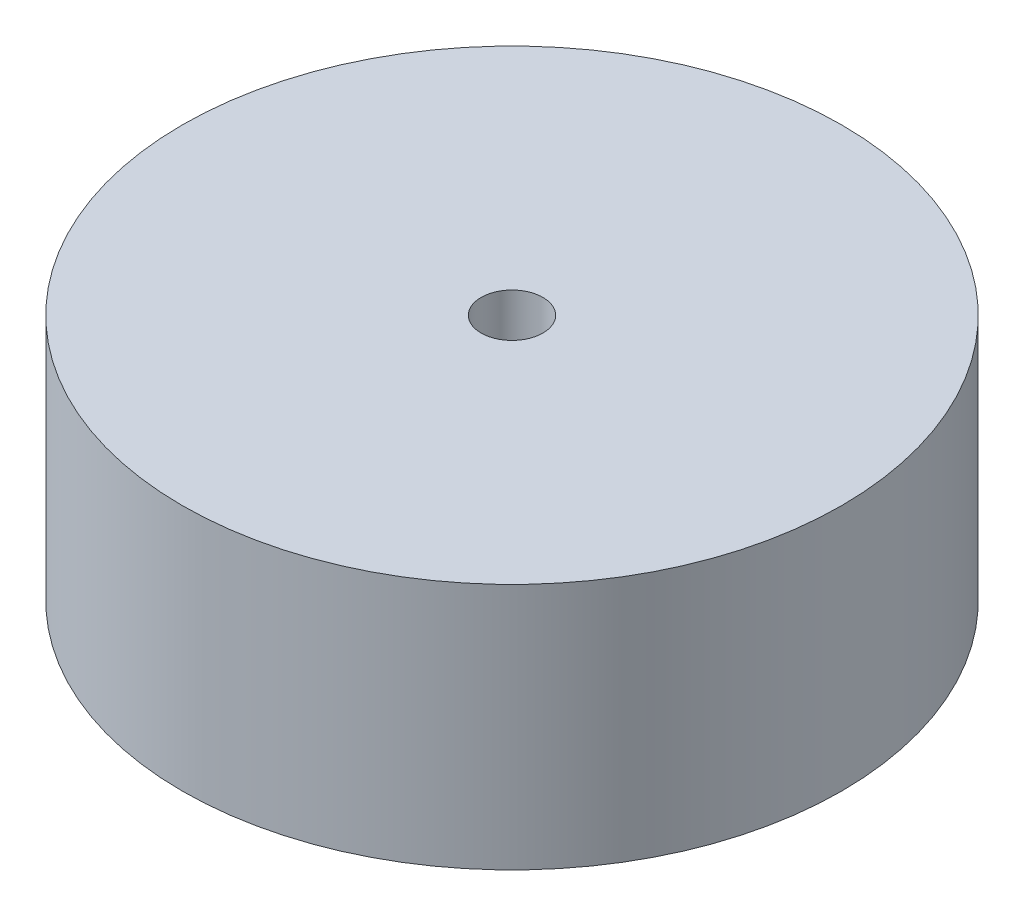
ISO-10303-21;
HEADER;
FILE_DESCRIPTION(('STEP AP214'),'2;1');
FILE_NAME('part.step','',(''),(''),'','','');
FILE_SCHEMA(('AUTOMOTIVE_DESIGN { 1 0 10303 214 1 1 1 1 }'));
ENDSEC;
DATA;
#1=APPLICATION_CONTEXT('core data for automotive mechanical design processes');
#2=APPLICATION_PROTOCOL_DEFINITION('international standard','automotive_design',2000,#1);
#3=PRODUCT_CONTEXT('',#1,'mechanical');
#4=PRODUCT('Part','Part','',(#3));
#5=PRODUCT_RELATED_PRODUCT_CATEGORY('part','',(#4));
#6=PRODUCT_DEFINITION_FORMATION('','',#4);
#7=PRODUCT_DEFINITION_CONTEXT('part definition',#1,'design');
#8=PRODUCT_DEFINITION('design','',#6,#7);
#9=PRODUCT_DEFINITION_SHAPE('','',#8);
#10=(LENGTH_UNIT() NAMED_UNIT(*) SI_UNIT(.MILLI.,.METRE.));
#11=(NAMED_UNIT(*) PLANE_ANGLE_UNIT() SI_UNIT($,.RADIAN.));
#12=(NAMED_UNIT(*) SI_UNIT($,.STERADIAN.) SOLID_ANGLE_UNIT());
#13=UNCERTAINTY_MEASURE_WITH_UNIT(LENGTH_MEASURE(1.E-05),#10,'distance_accuracy_value','');
#14=(GEOMETRIC_REPRESENTATION_CONTEXT(3) GLOBAL_UNCERTAINTY_ASSIGNED_CONTEXT((#13)) GLOBAL_UNIT_ASSIGNED_CONTEXT((#10,
#11,#12)) REPRESENTATION_CONTEXT('',''));
#15=CARTESIAN_POINT('',(0.,0.,0.));
#16=DIRECTION('',(0.,0.,1.));
#17=DIRECTION('',(1.,0.,0.));
#18=AXIS2_PLACEMENT_3D('',#15,#16,#17);
#19=CARTESIAN_POINT('',(0.,76.2,0.));
#20=DIRECTION('',(0.,-1.,0.));
#21=DIRECTION('',(0.,0.,-1.));
#22=AXIS2_PLACEMENT_3D('',#19,#20,#21);
#23=CYLINDRICAL_SURFACE('',#22,101.6);
#24=CARTESIAN_POINT('',(0.,76.2,0.));
#25=DIRECTION('',(0.,1.,0.));
#26=DIRECTION('',(0.,0.,1.));
#27=AXIS2_PLACEMENT_3D('',#24,#25,#26);
#28=CIRCLE('',#27,101.6);
#29=CARTESIAN_POINT('',(0.,76.2,-101.6));
#30=VERTEX_POINT('',#29);
#31=EDGE_CURVE('E10',#30,#30,#28,.T.);
#32=CARTESIAN_POINT('',(0.,0.,0.));
#33=DIRECTION('',(0.,1.,0.));
#34=DIRECTION('',(0.,0.,1.));
#35=AXIS2_PLACEMENT_3D('',#32,#33,#34);
#36=CIRCLE('',#35,101.6);
#37=CARTESIAN_POINT('',(0.,0.,-101.6));
#38=VERTEX_POINT('',#37);
#39=EDGE_CURVE('E40',#38,#38,#36,.T.);
#40=CARTESIAN_POINT('',(0.,76.2,-101.6));
#41=CARTESIAN_POINT('',(0.,75.40625,-101.6));
#42=CARTESIAN_POINT('',(0.,74.6125,-101.6));
#43=CARTESIAN_POINT('',(0.,73.025,-101.6));
#44=CARTESIAN_POINT('',(0.,72.23125,-101.6));
#45=CARTESIAN_POINT('',(0.,70.64375,-101.6));
#46=CARTESIAN_POINT('',(0.,69.85,-101.6));
#47=CARTESIAN_POINT('',(0.,68.2625,-101.6));
#48=CARTESIAN_POINT('',(0.,67.46875,-101.6));
#49=CARTESIAN_POINT('',(0.,65.88125,-101.6));
#50=CARTESIAN_POINT('',(0.,65.0875,-101.6));
#51=CARTESIAN_POINT('',(0.,63.5,-101.6));
#52=CARTESIAN_POINT('',(0.,62.70625,-101.6));
#53=CARTESIAN_POINT('',(0.,61.11875,-101.6));
#54=CARTESIAN_POINT('',(0.,60.325,-101.6));
#55=CARTESIAN_POINT('',(0.,58.7375,-101.6));
#56=CARTESIAN_POINT('',(0.,57.94375,-101.6));
#57=CARTESIAN_POINT('',(0.,56.35625,-101.6));
#58=CARTESIAN_POINT('',(0.,55.5625,-101.6));
#59=CARTESIAN_POINT('',(0.,53.975,-101.6));
#60=CARTESIAN_POINT('',(0.,53.18125,-101.6));
#61=CARTESIAN_POINT('',(0.,51.59375,-101.6));
#62=CARTESIAN_POINT('',(0.,50.8,-101.6));
#63=CARTESIAN_POINT('',(0.,49.2125,-101.6));
#64=CARTESIAN_POINT('',(0.,48.41875,-101.6));
#65=CARTESIAN_POINT('',(0.,46.83125,-101.6));
#66=CARTESIAN_POINT('',(0.,46.0375,-101.6));
#67=CARTESIAN_POINT('',(0.,44.45,-101.6));
#68=CARTESIAN_POINT('',(0.,43.65625,-101.6));
#69=CARTESIAN_POINT('',(0.,42.06875,-101.6));
#70=CARTESIAN_POINT('',(0.,41.275,-101.6));
#71=CARTESIAN_POINT('',(0.,39.6875,-101.6));
#72=CARTESIAN_POINT('',(0.,38.89375,-101.6));
#73=CARTESIAN_POINT('',(0.,37.30625,-101.6));
#74=CARTESIAN_POINT('',(0.,36.5125,-101.6));
#75=CARTESIAN_POINT('',(0.,34.925,-101.6));
#76=CARTESIAN_POINT('',(0.,34.13125,-101.6));
#77=CARTESIAN_POINT('',(0.,32.54375,-101.6));
#78=CARTESIAN_POINT('',(0.,31.75,-101.6));
#79=CARTESIAN_POINT('',(0.,30.1625,-101.6));
#80=CARTESIAN_POINT('',(0.,29.36875,-101.6));
#81=CARTESIAN_POINT('',(0.,27.78125,-101.6));
#82=CARTESIAN_POINT('',(0.,26.9875,-101.6));
#83=CARTESIAN_POINT('',(0.,25.4,-101.6));
#84=CARTESIAN_POINT('',(0.,24.60625,-101.6));
#85=CARTESIAN_POINT('',(0.,23.01875,-101.6));
#86=CARTESIAN_POINT('',(0.,22.225,-101.6));
#87=CARTESIAN_POINT('',(0.,20.6375,-101.6));
#88=CARTESIAN_POINT('',(0.,19.84375,-101.6));
#89=CARTESIAN_POINT('',(0.,18.25625,-101.6));
#90=CARTESIAN_POINT('',(0.,17.4625,-101.6));
#91=CARTESIAN_POINT('',(0.,15.875,-101.6));
#92=CARTESIAN_POINT('',(0.,15.08125,-101.6));
#93=CARTESIAN_POINT('',(0.,13.49375,-101.6));
#94=CARTESIAN_POINT('',(0.,12.7,-101.6));
#95=CARTESIAN_POINT('',(0.,11.1125,-101.6));
#96=CARTESIAN_POINT('',(0.,10.31875,-101.6));
#97=CARTESIAN_POINT('',(0.,8.73125,-101.6));
#98=CARTESIAN_POINT('',(0.,7.93750000000001,-101.6));
#99=CARTESIAN_POINT('',(0.,6.35,-101.6));
#100=CARTESIAN_POINT('',(0.,5.55625,-101.6));
#101=CARTESIAN_POINT('',(0.,3.96875,-101.6));
#102=CARTESIAN_POINT('',(0.,3.175,-101.6));
#103=CARTESIAN_POINT('',(0.,1.5875,-101.6));
#104=CARTESIAN_POINT('',(0.,0.793750000000001,-101.6));
#105=CARTESIAN_POINT('',(0.,0.,-101.6));
#106=B_SPLINE_CURVE_WITH_KNOTS('',3,(#40,#41,#42,#43,#44,#45,#46,#47,#48,#49,#50,#51,#52,#53,
#54,#55,#56,#57,#58,#59,#60,#61,#62,#63,#64,#65,#66,#67,#68,#69,#70,#71,#72,#73,#74,#75,#76,#77,
#78,#79,#80,#81,#82,#83,#84,#85,#86,#87,#88,#89,#90,#91,#92,#93,#94,#95,#96,#97,#98,#99,#100,
#101,#102,#103,#104,#105),.UNSPECIFIED.,.F.,.F.,(4,2,2,2,2,2,2,2,2,2,2,2,2,2,2,2,2,2,2,2,2,2,2,
2,2,2,2,2,2,2,2,2,4),(0.,2.38125,4.7625,7.14375,9.52500000000001,11.90625,14.2875,16.66875,
19.05,21.43125,23.8125,26.19375,28.575,30.95625,33.3375,35.71875,38.1,40.48125,42.8625,45.24375,
47.625,50.00625,52.3875,54.76875,57.15,59.53125,61.9125,64.29375,66.675,69.05625,71.4375,
73.81875,76.2),.UNSPECIFIED.);
#107=EDGE_CURVE('BSEAM37',#30,#38,#106,.T.);
#108=ORIENTED_EDGE('',*,*,#31,.F.);
#109=ORIENTED_EDGE('',*,*,#39,.T.);
#110=ORIENTED_EDGE('',*,*,#107,.T.);
#111=ORIENTED_EDGE('',*,*,#107,.F.);
#112=EDGE_LOOP('',(#108,#110,#109,#111));
#113=FACE_BOUND('',#112,.T.);
#114=ADVANCED_FACE('F37',(#113),#23,.T.);
#115=CARTESIAN_POINT('',(0.,76.2,0.));
#116=DIRECTION('',(0.,1.,0.));
#117=DIRECTION('',(0.,0.,1.));
#118=AXIS2_PLACEMENT_3D('',#115,#116,#117);
#119=PLANE('',#118);
#120=CARTESIAN_POINT('',(0.,76.2,0.));
#121=DIRECTION('',(0.,1.,0.));
#122=DIRECTION('',(0.,0.,1.));
#123=AXIS2_PLACEMENT_3D('',#120,#121,#122);
#124=CIRCLE('',#123,9.525);
#125=CARTESIAN_POINT('',(0.,76.2,9.525));
#126=VERTEX_POINT('',#125);
#127=EDGE_CURVE('E51',#126,#126,#124,.T.);
#128=ORIENTED_EDGE('',*,*,#127,.F.);
#129=EDGE_LOOP('',(#128));
#130=FACE_BOUND('',#129,.T.);
#131=ORIENTED_EDGE('',*,*,#31,.T.);
#132=EDGE_LOOP('',(#131));
#133=FACE_BOUND('',#132,.T.);
#134=ADVANCED_FACE('F68',(#130,#133),#119,.T.);
#135=CARTESIAN_POINT('',(0.,0.,0.));
#136=DIRECTION('',(0.,1.,0.));
#137=DIRECTION('',(0.,0.,1.));
#138=AXIS2_PLACEMENT_3D('',#135,#136,#137);
#139=PLANE('',#138);
#140=CARTESIAN_POINT('',(0.,0.,0.));
#141=DIRECTION('',(0.,1.,0.));
#142=DIRECTION('',(0.,0.,1.));
#143=AXIS2_PLACEMENT_3D('',#140,#141,#142);
#144=CIRCLE('',#143,9.525);
#145=CARTESIAN_POINT('',(0.,0.,9.525));
#146=VERTEX_POINT('',#145);
#147=EDGE_CURVE('E49',#146,#146,#144,.T.);
#148=ORIENTED_EDGE('',*,*,#147,.T.);
#149=EDGE_LOOP('',(#148));
#150=FACE_BOUND('',#149,.T.);
#151=ORIENTED_EDGE('',*,*,#39,.F.);
#152=EDGE_LOOP('',(#151));
#153=FACE_BOUND('',#152,.T.);
#154=ADVANCED_FACE('F59',(#150,#153),#139,.F.);
#155=CARTESIAN_POINT('',(0.,0.,0.));
#156=DIRECTION('',(0.,1.,0.));
#157=DIRECTION('',(0.,0.,1.));
#158=AXIS2_PLACEMENT_3D('',#155,#156,#157);
#159=CYLINDRICAL_SURFACE('',#158,9.525);
#160=CARTESIAN_POINT('',(0.,0.,9.525));
#161=CARTESIAN_POINT('',(0.,0.79375,9.525));
#162=CARTESIAN_POINT('',(0.,1.5875,9.525));
#163=CARTESIAN_POINT('',(0.,3.175,9.525));
#164=CARTESIAN_POINT('',(0.,3.96875,9.525));
#165=CARTESIAN_POINT('',(0.,5.55625,9.525));
#166=CARTESIAN_POINT('',(0.,6.35,9.525));
#167=CARTESIAN_POINT('',(0.,7.9375,9.525));
#168=CARTESIAN_POINT('',(0.,8.73125,9.525));
#169=CARTESIAN_POINT('',(0.,10.31875,9.525));
#170=CARTESIAN_POINT('',(0.,11.1125,9.525));
#171=CARTESIAN_POINT('',(0.,12.7,9.525));
#172=CARTESIAN_POINT('',(0.,13.49375,9.525));
#173=CARTESIAN_POINT('',(0.,15.08125,9.525));
#174=CARTESIAN_POINT('',(0.,15.875,9.525));
#175=CARTESIAN_POINT('',(0.,17.4625,9.525));
#176=CARTESIAN_POINT('',(0.,18.25625,9.525));
#177=CARTESIAN_POINT('',(0.,19.84375,9.525));
#178=CARTESIAN_POINT('',(0.,20.6375,9.525));
#179=CARTESIAN_POINT('',(0.,22.225,9.525));
#180=CARTESIAN_POINT('',(0.,23.01875,9.525));
#181=CARTESIAN_POINT('',(0.,24.60625,9.525));
#182=CARTESIAN_POINT('',(0.,25.4,9.525));
#183=CARTESIAN_POINT('',(0.,26.9875,9.525));
#184=CARTESIAN_POINT('',(0.,27.78125,9.525));
#185=CARTESIAN_POINT('',(0.,29.36875,9.525));
#186=CARTESIAN_POINT('',(0.,30.1625,9.525));
#187=CARTESIAN_POINT('',(0.,31.75,9.525));
#188=CARTESIAN_POINT('',(0.,32.54375,9.525));
#189=CARTESIAN_POINT('',(0.,34.13125,9.525));
#190=CARTESIAN_POINT('',(0.,34.925,9.525));
#191=CARTESIAN_POINT('',(0.,36.5125,9.525));
#192=CARTESIAN_POINT('',(0.,37.30625,9.525));
#193=CARTESIAN_POINT('',(0.,38.89375,9.525));
#194=CARTESIAN_POINT('',(0.,39.6875,9.525));
#195=CARTESIAN_POINT('',(0.,41.275,9.525));
#196=CARTESIAN_POINT('',(0.,42.06875,9.525));
#197=CARTESIAN_POINT('',(0.,43.65625,9.525));
#198=CARTESIAN_POINT('',(0.,44.45,9.525));
#199=CARTESIAN_POINT('',(0.,46.0375,9.525));
#200=CARTESIAN_POINT('',(0.,46.83125,9.525));
#201=CARTESIAN_POINT('',(0.,48.41875,9.525));
#202=CARTESIAN_POINT('',(0.,49.2125,9.525));
#203=CARTESIAN_POINT('',(0.,50.8,9.525));
#204=CARTESIAN_POINT('',(0.,51.59375,9.525));
#205=CARTESIAN_POINT('',(0.,53.18125,9.525));
#206=CARTESIAN_POINT('',(0.,53.975,9.525));
#207=CARTESIAN_POINT('',(0.,55.5625,9.525));
#208=CARTESIAN_POINT('',(0.,56.35625,9.525));
#209=CARTESIAN_POINT('',(0.,57.94375,9.525));
#210=CARTESIAN_POINT('',(0.,58.7375,9.525));
#211=CARTESIAN_POINT('',(0.,60.325,9.525));
#212=CARTESIAN_POINT('',(0.,61.11875,9.525));
#213=CARTESIAN_POINT('',(0.,62.70625,9.525));
#214=CARTESIAN_POINT('',(0.,63.5,9.525));
#215=CARTESIAN_POINT('',(0.,65.0875,9.525));
#216=CARTESIAN_POINT('',(0.,65.88125,9.525));
#217=CARTESIAN_POINT('',(0.,67.46875,9.525));
#218=CARTESIAN_POINT('',(0.,68.2625,9.525));
#219=CARTESIAN_POINT('',(0.,69.85,9.525));
#220=CARTESIAN_POINT('',(0.,70.64375,9.525));
#221=CARTESIAN_POINT('',(0.,72.23125,9.525));
#222=CARTESIAN_POINT('',(0.,73.025,9.525));
#223=CARTESIAN_POINT('',(0.,74.6125,9.525));
#224=CARTESIAN_POINT('',(0.,75.40625,9.525));
#225=CARTESIAN_POINT('',(0.,76.2,9.525));
#226=B_SPLINE_CURVE_WITH_KNOTS('',3,(#160,#161,#162,#163,#164,#165,#166,#167,#168,#169,#170,
#171,#172,#173,#174,#175,#176,#177,#178,#179,#180,#181,#182,#183,#184,#185,#186,#187,#188,#189,
#190,#191,#192,#193,#194,#195,#196,#197,#198,#199,#200,#201,#202,#203,#204,#205,#206,#207,#208,
#209,#210,#211,#212,#213,#214,#215,#216,#217,#218,#219,#220,#221,#222,#223,#224,#225),
.UNSPECIFIED.,.F.,.F.,(4,2,2,2,2,2,2,2,2,2,2,2,2,2,2,2,2,2,2,2,2,2,2,2,2,2,2,2,2,2,2,2,4),(0.,
2.38125,4.7625,7.14375,9.525,11.90625,14.2875,16.66875,19.05,21.43125,23.8125,26.19375,28.575,
30.95625,33.3375,35.71875,38.1,40.48125,42.8625,45.24375,47.625,50.00625,52.3875,54.76875,57.15,
59.53125,61.9125,64.29375,66.675,69.05625,71.4375,73.81875,76.2),.UNSPECIFIED.);
#227=EDGE_CURVE('BSEAM62',#146,#126,#226,.T.);
#228=ORIENTED_EDGE('',*,*,#147,.F.);
#229=ORIENTED_EDGE('',*,*,#127,.T.);
#230=ORIENTED_EDGE('',*,*,#227,.T.);
#231=ORIENTED_EDGE('',*,*,#227,.F.);
#232=EDGE_LOOP('',(#228,#230,#229,#231));
#233=FACE_BOUND('',#232,.T.);
#234=ADVANCED_FACE('F62',(#233),#159,.F.);
#235=CLOSED_SHELL('',(#114,#134,#154,#234));
#236=MANIFOLD_SOLID_BREP('B2',#235);
#237=ADVANCED_BREP_SHAPE_REPRESENTATION('',(#18,#236),#14);
#238=SHAPE_DEFINITION_REPRESENTATION(#9,#237);
ENDSEC;
END-ISO-10303-21;
